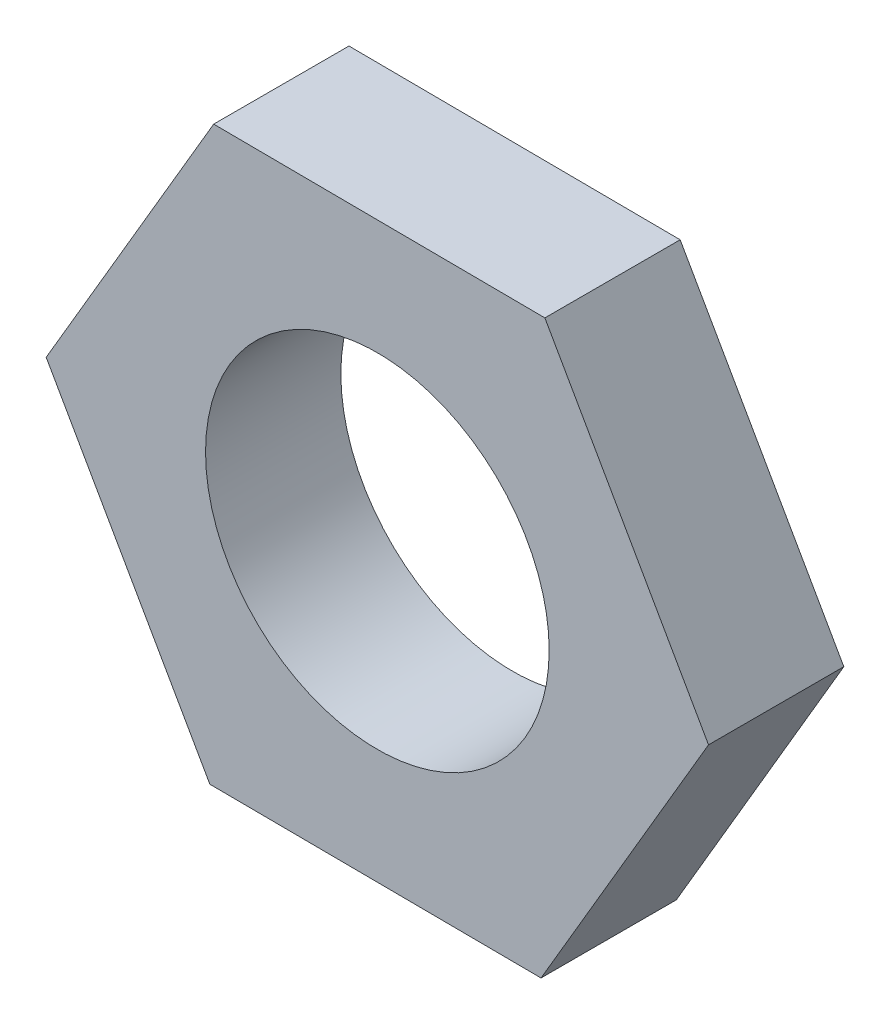
ISO-10303-21;
HEADER;
FILE_DESCRIPTION(('STEP AP214'),'2;1');
FILE_NAME('part.step','',(''),(''),'','','');
FILE_SCHEMA(('AUTOMOTIVE_DESIGN { 1 0 10303 214 1 1 1 1 }'));
ENDSEC;
DATA;
#1=APPLICATION_CONTEXT('core data for automotive mechanical design processes');
#2=APPLICATION_PROTOCOL_DEFINITION('international standard','automotive_design',2000,#1);
#3=PRODUCT_CONTEXT('',#1,'mechanical');
#4=PRODUCT('Part','Part','',(#3));
#5=PRODUCT_RELATED_PRODUCT_CATEGORY('part','',(#4));
#6=PRODUCT_DEFINITION_FORMATION('','',#4);
#7=PRODUCT_DEFINITION_CONTEXT('part definition',#1,'design');
#8=PRODUCT_DEFINITION('design','',#6,#7);
#9=PRODUCT_DEFINITION_SHAPE('','',#8);
#10=(LENGTH_UNIT() NAMED_UNIT(*) SI_UNIT(.MILLI.,.METRE.));
#11=(NAMED_UNIT(*) PLANE_ANGLE_UNIT() SI_UNIT($,.RADIAN.));
#12=(NAMED_UNIT(*) SI_UNIT($,.STERADIAN.) SOLID_ANGLE_UNIT());
#13=UNCERTAINTY_MEASURE_WITH_UNIT(LENGTH_MEASURE(1.E-05),#10,'distance_accuracy_value','');
#14=(GEOMETRIC_REPRESENTATION_CONTEXT(3) GLOBAL_UNCERTAINTY_ASSIGNED_CONTEXT((#13)) GLOBAL_UNIT_ASSIGNED_CONTEXT((#10,
#11,#12)) REPRESENTATION_CONTEXT('',''));
#15=CARTESIAN_POINT('',(0.,0.,0.));
#16=DIRECTION('',(0.,0.,1.));
#17=DIRECTION('',(1.,0.,0.));
#18=AXIS2_PLACEMENT_3D('',#15,#16,#17);
#19=CARTESIAN_POINT('',(0.,0.,2.5));
#20=DIRECTION('',(0.,0.,1.));
#21=DIRECTION('',(1.,0.,0.));
#22=AXIS2_PLACEMENT_3D('',#19,#20,#21);
#23=PLANE('',#22);
#24=DIRECTION('',(0.9999774020315,-0.00672275437092582,0.));
#25=VECTOR('',#24,1.);
#26=CARTESIAN_POINT('',(-3.09551787607199,-5.27930889532449,2.5));
#27=LINE('',#26,#25);
#28=CARTESIAN_POINT('',(-3.09551787607199,-5.27930889532449,2.5));
#29=VERTEX_POINT('',#28);
#30=CARTESIAN_POINT('',(3.02425667974018,-5.32045156620944,2.5));
#31=VERTEX_POINT('',#30);
#32=EDGE_CURVE('E129',#29,#31,#27,.T.);
#33=ORIENTED_EDGE('',*,*,#32,.T.);
#34=DIRECTION('',(0.505810777084374,0.862644456184181,0.));
#35=VECTOR('',#34,1.);
#36=CARTESIAN_POINT('',(3.02425667974018,-5.32045156620944,2.5));
#37=LINE('',#36,#35);
#38=CARTESIAN_POINT('',(6.11977455581216,-0.0411426708849466,2.5));
#39=VERTEX_POINT('',#38);
#40=EDGE_CURVE('E87',#31,#39,#37,.T.);
#41=ORIENTED_EDGE('',*,*,#40,.T.);
#42=DIRECTION('',(-0.494166624947125,0.869367210555107,0.));
#43=VECTOR('',#42,1.);
#44=CARTESIAN_POINT('',(6.11977455581216,-0.0411426708849466,2.5));
#45=LINE('',#44,#43);
#46=CARTESIAN_POINT('',(3.09551787607199,5.27930889532449,2.5));
#47=VERTEX_POINT('',#46);
#48=EDGE_CURVE('E100',#39,#47,#45,.T.);
#49=ORIENTED_EDGE('',*,*,#48,.T.);
#50=DIRECTION('',(-0.9999774020315,0.00672275437092553,0.));
#51=VECTOR('',#50,1.);
#52=CARTESIAN_POINT('',(3.09551787607199,5.27930889532449,2.5));
#53=LINE('',#52,#51);
#54=CARTESIAN_POINT('',(-3.02425667974018,5.32045156620944,2.5));
#55=VERTEX_POINT('',#54);
#56=EDGE_CURVE('E94',#47,#55,#53,.T.);
#57=ORIENTED_EDGE('',*,*,#56,.T.);
#58=DIRECTION('',(-0.505810777084374,-0.862644456184181,0.));
#59=VECTOR('',#58,1.);
#60=CARTESIAN_POINT('',(-3.02425667974018,5.32045156620944,2.5));
#61=LINE('',#60,#59);
#62=CARTESIAN_POINT('',(-6.11977455581216,0.0411426708849458,2.5));
#63=VERTEX_POINT('',#62);
#64=EDGE_CURVE('E98',#55,#63,#61,.T.);
#65=ORIENTED_EDGE('',*,*,#64,.T.);
#66=DIRECTION('',(0.494166624947126,-0.869367210555106,0.));
#67=VECTOR('',#66,1.);
#68=CARTESIAN_POINT('',(-6.11977455581216,0.0411426708849458,2.5));
#69=LINE('',#68,#67);
#70=EDGE_CURVE('E50',#63,#29,#69,.T.);
#71=ORIENTED_EDGE('',*,*,#70,.T.);
#72=EDGE_LOOP('',(#33,#41,#49,#57,#65,#71));
#73=FACE_BOUND('',#72,.T.);
#74=CARTESIAN_POINT('',(0.,0.,2.5));
#75=DIRECTION('',(0.,0.,1.));
#76=DIRECTION('',(1.,0.,0.));
#77=AXIS2_PLACEMENT_3D('',#74,#75,#76);
#78=CIRCLE('',#77,3.175);
#79=CARTESIAN_POINT('',(3.175,0.,2.5));
#80=VERTEX_POINT('',#79);
#81=EDGE_CURVE('E122',#80,#80,#78,.T.);
#82=ORIENTED_EDGE('',*,*,#81,.F.);
#83=EDGE_LOOP('',(#82));
#84=FACE_BOUND('',#83,.T.);
#85=ADVANCED_FACE('F33',(#73,#84),#23,.T.);
#86=CARTESIAN_POINT('',(0.,0.,0.));
#87=DIRECTION('',(0.,0.,1.));
#88=DIRECTION('',(1.,0.,0.));
#89=AXIS2_PLACEMENT_3D('',#86,#87,#88);
#90=PLANE('',#89);
#91=DIRECTION('',(0.9999774020315,-0.00672275437092582,0.));
#92=VECTOR('',#91,1.);
#93=CARTESIAN_POINT('',(-3.09551787607199,-5.27930889532449,0.));
#94=LINE('',#93,#92);
#95=CARTESIAN_POINT('',(-3.09551787607199,-5.27930889532449,0.));
#96=VERTEX_POINT('',#95);
#97=CARTESIAN_POINT('',(3.02425667974018,-5.32045156620944,0.));
#98=VERTEX_POINT('',#97);
#99=EDGE_CURVE('E118',#96,#98,#94,.T.);
#100=ORIENTED_EDGE('',*,*,#99,.F.);
#101=DIRECTION('',(0.494166624947126,-0.869367210555106,0.));
#102=VECTOR('',#101,1.);
#103=CARTESIAN_POINT('',(-6.11977455581216,0.0411426708849458,0.));
#104=LINE('',#103,#102);
#105=CARTESIAN_POINT('',(-6.11977455581216,0.0411426708849458,0.));
#106=VERTEX_POINT('',#105);
#107=EDGE_CURVE('E79',#106,#96,#104,.T.);
#108=ORIENTED_EDGE('',*,*,#107,.F.);
#109=DIRECTION('',(-0.505810777084374,-0.862644456184181,0.));
#110=VECTOR('',#109,1.);
#111=CARTESIAN_POINT('',(-3.02425667974018,5.32045156620944,0.));
#112=LINE('',#111,#110);
#113=CARTESIAN_POINT('',(-3.02425667974018,5.32045156620944,0.));
#114=VERTEX_POINT('',#113);
#115=EDGE_CURVE('E73',#114,#106,#112,.T.);
#116=ORIENTED_EDGE('',*,*,#115,.F.);
#117=DIRECTION('',(-0.9999774020315,0.00672275437092553,0.));
#118=VECTOR('',#117,1.);
#119=CARTESIAN_POINT('',(3.09551787607199,5.27930889532449,0.));
#120=LINE('',#119,#118);
#121=CARTESIAN_POINT('',(3.09551787607199,5.27930889532449,0.));
#122=VERTEX_POINT('',#121);
#123=EDGE_CURVE('E108',#122,#114,#120,.T.);
#124=ORIENTED_EDGE('',*,*,#123,.F.);
#125=DIRECTION('',(-0.494166624947125,0.869367210555107,0.));
#126=VECTOR('',#125,1.);
#127=CARTESIAN_POINT('',(6.11977455581216,-0.0411426708849466,0.));
#128=LINE('',#127,#126);
#129=CARTESIAN_POINT('',(6.11977455581216,-0.0411426708849466,0.));
#130=VERTEX_POINT('',#129);
#131=EDGE_CURVE('E124',#130,#122,#128,.T.);
#132=ORIENTED_EDGE('',*,*,#131,.F.);
#133=DIRECTION('',(0.505810777084374,0.862644456184181,0.));
#134=VECTOR('',#133,1.);
#135=CARTESIAN_POINT('',(3.02425667974018,-5.32045156620944,0.));
#136=LINE('',#135,#134);
#137=EDGE_CURVE('E121',#98,#130,#136,.T.);
#138=ORIENTED_EDGE('',*,*,#137,.F.);
#139=EDGE_LOOP('',(#100,#108,#116,#124,#132,#138));
#140=FACE_BOUND('',#139,.T.);
#141=CARTESIAN_POINT('',(0.,0.,0.));
#142=DIRECTION('',(0.,0.,1.));
#143=DIRECTION('',(1.,0.,0.));
#144=AXIS2_PLACEMENT_3D('',#141,#142,#143);
#145=CIRCLE('',#144,3.175);
#146=CARTESIAN_POINT('',(3.175,0.,0.));
#147=VERTEX_POINT('',#146);
#148=EDGE_CURVE('E222',#147,#147,#145,.T.);
#149=ORIENTED_EDGE('',*,*,#148,.T.);
#150=EDGE_LOOP('',(#149));
#151=FACE_BOUND('',#150,.T.);
#152=ADVANCED_FACE('F138',(#140,#151),#90,.F.);
#153=CARTESIAN_POINT('',(-3.09551787607199,-5.27930889532449,2.5));
#154=DIRECTION('',(0.00672275437092582,0.9999774020315,0.));
#155=DIRECTION('',(-0.9999774020315,0.00672275437092582,0.));
#156=AXIS2_PLACEMENT_3D('',#153,#154,#155);
#157=PLANE('',#156);
#158=ORIENTED_EDGE('',*,*,#99,.T.);
#159=DIRECTION('',(0.,0.,-1.));
#160=VECTOR('',#159,1.);
#161=CARTESIAN_POINT('',(3.02425667974018,-5.32045156620944,2.5));
#162=LINE('',#161,#160);
#163=EDGE_CURVE('E11',#31,#98,#162,.T.);
#164=ORIENTED_EDGE('',*,*,#163,.F.);
#165=ORIENTED_EDGE('',*,*,#32,.F.);
#166=DIRECTION('',(0.,0.,-1.));
#167=VECTOR('',#166,1.);
#168=CARTESIAN_POINT('',(-3.09551787607199,-5.27930889532449,2.5));
#169=LINE('',#168,#167);
#170=EDGE_CURVE('E114',#29,#96,#169,.T.);
#171=ORIENTED_EDGE('',*,*,#170,.T.);
#172=EDGE_LOOP('',(#158,#164,#165,#171));
#173=FACE_BOUND('',#172,.T.);
#174=ADVANCED_FACE('F35',(#173),#157,.F.);
#175=CARTESIAN_POINT('',(3.02425667974018,-5.32045156620944,2.5));
#176=DIRECTION('',(-0.862644456184181,0.505810777084374,0.));
#177=DIRECTION('',(-0.505810777084374,-0.862644456184181,0.));
#178=AXIS2_PLACEMENT_3D('',#175,#176,#177);
#179=PLANE('',#178);
#180=ORIENTED_EDGE('',*,*,#137,.T.);
#181=DIRECTION('',(0.,0.,-1.));
#182=VECTOR('',#181,1.);
#183=CARTESIAN_POINT('',(6.11977455581216,-0.0411426708849466,2.5));
#184=LINE('',#183,#182);
#185=EDGE_CURVE('E42',#39,#130,#184,.T.);
#186=ORIENTED_EDGE('',*,*,#185,.F.);
#187=ORIENTED_EDGE('',*,*,#40,.F.);
#188=ORIENTED_EDGE('',*,*,#163,.T.);
#189=EDGE_LOOP('',(#180,#186,#187,#188));
#190=FACE_BOUND('',#189,.T.);
#191=ADVANCED_FACE('F163',(#190),#179,.F.);
#192=CARTESIAN_POINT('',(6.11977455581216,-0.0411426708849466,2.5));
#193=DIRECTION('',(-0.869367210555107,-0.494166624947125,0.));
#194=DIRECTION('',(0.494166624947125,-0.869367210555107,0.));
#195=AXIS2_PLACEMENT_3D('',#192,#193,#194);
#196=PLANE('',#195);
#197=ORIENTED_EDGE('',*,*,#131,.T.);
#198=DIRECTION('',(0.,0.,-1.));
#199=VECTOR('',#198,1.);
#200=CARTESIAN_POINT('',(3.09551787607199,5.27930889532449,2.5));
#201=LINE('',#200,#199);
#202=EDGE_CURVE('E109',#47,#122,#201,.T.);
#203=ORIENTED_EDGE('',*,*,#202,.F.);
#204=ORIENTED_EDGE('',*,*,#48,.F.);
#205=ORIENTED_EDGE('',*,*,#185,.T.);
#206=EDGE_LOOP('',(#197,#203,#204,#205));
#207=FACE_BOUND('',#206,.T.);
#208=ADVANCED_FACE('F135',(#207),#196,.F.);
#209=CARTESIAN_POINT('',(3.09551787607199,5.27930889532449,2.5));
#210=DIRECTION('',(-0.00672275437092553,-0.9999774020315,0.));
#211=DIRECTION('',(0.9999774020315,-0.00672275437092553,0.));
#212=AXIS2_PLACEMENT_3D('',#209,#210,#211);
#213=PLANE('',#212);
#214=ORIENTED_EDGE('',*,*,#123,.T.);
#215=DIRECTION('',(0.,0.,-1.));
#216=VECTOR('',#215,1.);
#217=CARTESIAN_POINT('',(-3.02425667974018,5.32045156620944,2.5));
#218=LINE('',#217,#216);
#219=EDGE_CURVE('E105',#55,#114,#218,.T.);
#220=ORIENTED_EDGE('',*,*,#219,.F.);
#221=ORIENTED_EDGE('',*,*,#56,.F.);
#222=ORIENTED_EDGE('',*,*,#202,.T.);
#223=EDGE_LOOP('',(#214,#220,#221,#222));
#224=FACE_BOUND('',#223,.T.);
#225=ADVANCED_FACE('F106',(#224),#213,.F.);
#226=CARTESIAN_POINT('',(-3.02425667974018,5.32045156620944,2.5));
#227=DIRECTION('',(0.862644456184181,-0.505810777084374,0.));
#228=DIRECTION('',(0.505810777084374,0.862644456184181,0.));
#229=AXIS2_PLACEMENT_3D('',#226,#227,#228);
#230=PLANE('',#229);
#231=ORIENTED_EDGE('',*,*,#115,.T.);
#232=DIRECTION('',(0.,0.,-1.));
#233=VECTOR('',#232,1.);
#234=CARTESIAN_POINT('',(-6.11977455581216,0.0411426708849458,2.5));
#235=LINE('',#234,#233);
#236=EDGE_CURVE('E110',#63,#106,#235,.T.);
#237=ORIENTED_EDGE('',*,*,#236,.F.);
#238=ORIENTED_EDGE('',*,*,#64,.F.);
#239=ORIENTED_EDGE('',*,*,#219,.T.);
#240=EDGE_LOOP('',(#231,#237,#238,#239));
#241=FACE_BOUND('',#240,.T.);
#242=ADVANCED_FACE('F112',(#241),#230,.F.);
#243=CARTESIAN_POINT('',(-6.11977455581216,0.0411426708849458,2.5));
#244=DIRECTION('',(0.869367210555107,0.494166624947126,0.));
#245=DIRECTION('',(-0.494166624947126,0.869367210555107,0.));
#246=AXIS2_PLACEMENT_3D('',#243,#244,#245);
#247=PLANE('',#246);
#248=ORIENTED_EDGE('',*,*,#107,.T.);
#249=ORIENTED_EDGE('',*,*,#170,.F.);
#250=ORIENTED_EDGE('',*,*,#70,.F.);
#251=ORIENTED_EDGE('',*,*,#236,.T.);
#252=EDGE_LOOP('',(#248,#249,#250,#251));
#253=FACE_BOUND('',#252,.T.);
#254=ADVANCED_FACE('F143',(#253),#247,.F.);
#255=CARTESIAN_POINT('',(0.,0.,2.5));
#256=DIRECTION('',(0.,0.,-1.));
#257=DIRECTION('',(-1.,0.,0.));
#258=AXIS2_PLACEMENT_3D('',#255,#256,#257);
#259=CYLINDRICAL_SURFACE('',#258,3.175);
#260=ORIENTED_EDGE('',*,*,#81,.T.);
#261=EDGE_LOOP('',(#260));
#262=FACE_BOUND('',#261,.T.);
#263=ORIENTED_EDGE('',*,*,#148,.F.);
#264=EDGE_LOOP('',(#263));
#265=FACE_BOUND('',#264,.T.);
#266=ADVANCED_FACE('F145',(#262,#265),#259,.F.);
#267=CLOSED_SHELL('',(#85,#152,#174,#191,#208,#225,#242,#254,#266));
#268=MANIFOLD_SOLID_BREP('B2',#267);
#269=ADVANCED_BREP_SHAPE_REPRESENTATION('',(#18,#268),#14);
#270=SHAPE_DEFINITION_REPRESENTATION(#9,#269);
ENDSEC;
END-ISO-10303-21;
